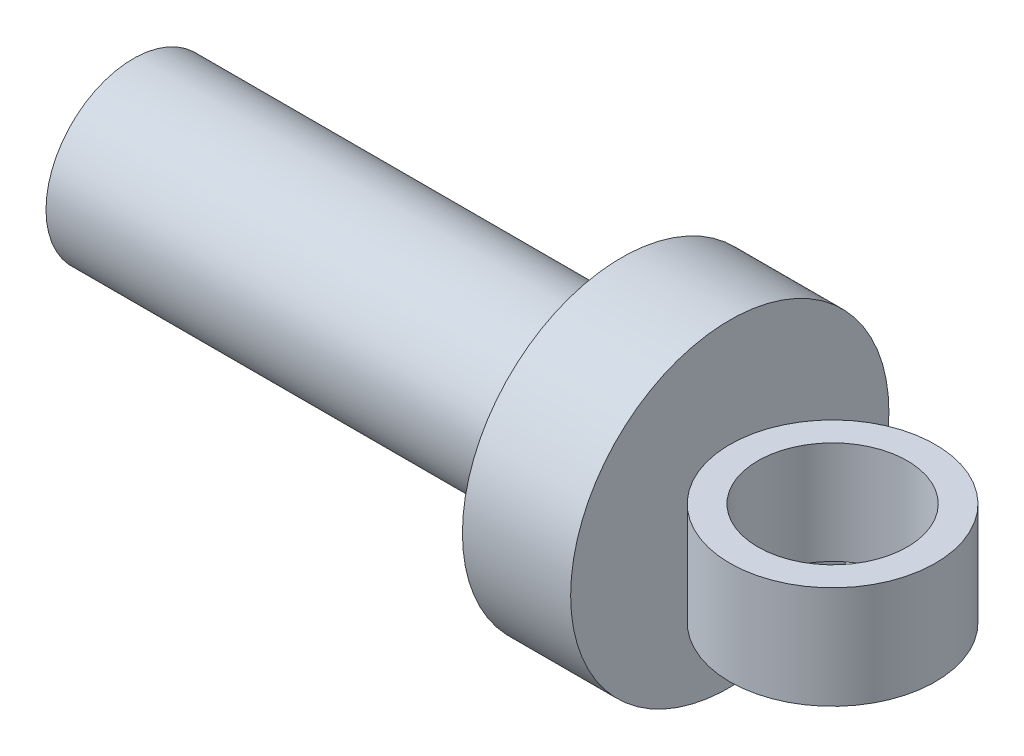
ISO-10303-21;
HEADER;
FILE_DESCRIPTION(('STEP AP214'),'2;1');
FILE_NAME('part.step','',(''),(''),'','','');
FILE_SCHEMA(('AUTOMOTIVE_DESIGN { 1 0 10303 214 1 1 1 1 }'));
ENDSEC;
DATA;
#1=APPLICATION_CONTEXT('core data for automotive mechanical design processes');
#2=APPLICATION_PROTOCOL_DEFINITION('international standard','automotive_design',2000,#1);
#3=PRODUCT_CONTEXT('',#1,'mechanical');
#4=PRODUCT('Part','Part','',(#3));
#5=PRODUCT_RELATED_PRODUCT_CATEGORY('part','',(#4));
#6=PRODUCT_DEFINITION_FORMATION('','',#4);
#7=PRODUCT_DEFINITION_CONTEXT('part definition',#1,'design');
#8=PRODUCT_DEFINITION('design','',#6,#7);
#9=PRODUCT_DEFINITION_SHAPE('','',#8);
#10=(LENGTH_UNIT() NAMED_UNIT(*) SI_UNIT(.MILLI.,.METRE.));
#11=(NAMED_UNIT(*) PLANE_ANGLE_UNIT() SI_UNIT($,.RADIAN.));
#12=(NAMED_UNIT(*) SI_UNIT($,.STERADIAN.) SOLID_ANGLE_UNIT());
#13=UNCERTAINTY_MEASURE_WITH_UNIT(LENGTH_MEASURE(1.E-05),#10,'distance_accuracy_value','');
#14=(GEOMETRIC_REPRESENTATION_CONTEXT(3) GLOBAL_UNCERTAINTY_ASSIGNED_CONTEXT((#13)) GLOBAL_UNIT_ASSIGNED_CONTEXT((#10,
#11,#12)) REPRESENTATION_CONTEXT('',''));
#15=CARTESIAN_POINT('',(0.,0.,0.));
#16=DIRECTION('',(0.,0.,1.));
#17=DIRECTION('',(1.,0.,0.));
#18=AXIS2_PLACEMENT_3D('',#15,#16,#17);
#19=CARTESIAN_POINT('',(20.03,10.,0.));
#20=DIRECTION('',(0.,1.,0.));
#21=DIRECTION('',(0.,0.,1.));
#22=AXIS2_PLACEMENT_3D('',#19,#20,#21);
#23=PLANE('',#22);
#24=CARTESIAN_POINT('',(20.03,10.,0.));
#25=DIRECTION('',(0.,1.,0.));
#26=DIRECTION('',(0.,0.,1.));
#27=AXIS2_PLACEMENT_3D('',#24,#25,#26);
#28=CIRCLE('',#27,20.03);
#29=CARTESIAN_POINT('',(20.03,10.,20.03));
#30=VERTEX_POINT('',#29);
#31=EDGE_CURVE('E11',#30,#30,#28,.T.);
#32=ORIENTED_EDGE('',*,*,#31,.T.);
#33=EDGE_LOOP('',(#32));
#34=FACE_BOUND('',#33,.T.);
#35=CARTESIAN_POINT('',(20.03,10.,0.));
#36=DIRECTION('',(0.,1.,0.));
#37=DIRECTION('',(0.,0.,1.));
#38=AXIS2_PLACEMENT_3D('',#35,#36,#37);
#39=CIRCLE('',#38,14.555);
#40=CARTESIAN_POINT('',(20.03,10.,14.555));
#41=VERTEX_POINT('',#40);
#42=EDGE_CURVE('E53',#41,#41,#39,.T.);
#43=ORIENTED_EDGE('',*,*,#42,.F.);
#44=EDGE_LOOP('',(#43));
#45=FACE_BOUND('',#44,.T.);
#46=ADVANCED_FACE('F42',(#34,#45),#23,.T.);
#47=CARTESIAN_POINT('',(20.03,-10.,0.));
#48=DIRECTION('',(0.,1.,0.));
#49=DIRECTION('',(0.,0.,1.));
#50=AXIS2_PLACEMENT_3D('',#47,#48,#49);
#51=PLANE('',#50);
#52=CARTESIAN_POINT('',(20.03,-10.,0.));
#53=DIRECTION('',(0.,1.,0.));
#54=DIRECTION('',(0.,0.,1.));
#55=AXIS2_PLACEMENT_3D('',#52,#53,#54);
#56=CIRCLE('',#55,20.03);
#57=CARTESIAN_POINT('',(20.03,-10.,20.03));
#58=VERTEX_POINT('',#57);
#59=EDGE_CURVE('E46',#58,#58,#56,.T.);
#60=ORIENTED_EDGE('',*,*,#59,.F.);
#61=EDGE_LOOP('',(#60));
#62=FACE_BOUND('',#61,.T.);
#63=CARTESIAN_POINT('',(20.03,-10.,0.));
#64=DIRECTION('',(0.,1.,0.));
#65=DIRECTION('',(0.,0.,1.));
#66=AXIS2_PLACEMENT_3D('',#63,#64,#65);
#67=CIRCLE('',#66,14.555);
#68=CARTESIAN_POINT('',(20.03,-10.,14.555));
#69=VERTEX_POINT('',#68);
#70=EDGE_CURVE('E55',#69,#69,#67,.T.);
#71=ORIENTED_EDGE('',*,*,#70,.T.);
#72=EDGE_LOOP('',(#71));
#73=FACE_BOUND('',#72,.T.);
#74=ADVANCED_FACE('F65',(#62,#73),#51,.F.);
#75=CARTESIAN_POINT('',(20.03,10.,0.));
#76=DIRECTION('',(0.,-1.,0.));
#77=DIRECTION('',(0.,0.,-1.));
#78=AXIS2_PLACEMENT_3D('',#75,#76,#77);
#79=CYLINDRICAL_SURFACE('',#78,20.03);
#80=ORIENTED_EDGE('',*,*,#31,.F.);
#81=EDGE_LOOP('',(#80));
#82=FACE_BOUND('',#81,.T.);
#83=ORIENTED_EDGE('',*,*,#59,.T.);
#84=EDGE_LOOP('',(#83));
#85=FACE_BOUND('',#84,.T.);
#86=ADVANCED_FACE('F44',(#82,#85),#79,.T.);
#87=CARTESIAN_POINT('',(20.03,10.,0.));
#88=DIRECTION('',(0.,-1.,0.));
#89=DIRECTION('',(0.,0.,-1.));
#90=AXIS2_PLACEMENT_3D('',#87,#88,#89);
#91=CYLINDRICAL_SURFACE('',#90,14.555);
#92=ORIENTED_EDGE('',*,*,#42,.T.);
#93=EDGE_LOOP('',(#92));
#94=FACE_BOUND('',#93,.T.);
#95=ORIENTED_EDGE('',*,*,#70,.F.);
#96=EDGE_LOOP('',(#95));
#97=FACE_BOUND('',#96,.T.);
#98=ADVANCED_FACE('F61',(#94,#97),#91,.F.);
#99=CLOSED_SHELL('',(#46,#74,#86,#98));
#100=MANIFOLD_SOLID_BREP('B2',#99);
#101=CARTESIAN_POINT('',(-116.2,17.,0.));
#102=DIRECTION('',(1.,0.,0.));
#103=DIRECTION('',(0.,0.,-1.));
#104=AXIS2_PLACEMENT_3D('',#101,#102,#103);
#105=PLANE('',#104);
#106=CARTESIAN_POINT('',(-116.2,0.,0.));
#107=DIRECTION('',(-1.,0.,0.));
#108=DIRECTION('',(0.,0.,1.));
#109=AXIS2_PLACEMENT_3D('',#106,#107,#108);
#110=CIRCLE('',#109,12.);
#111=CARTESIAN_POINT('',(-116.2,0.,12.));
#112=VERTEX_POINT('',#111);
#113=EDGE_CURVE('E41',#112,#112,#110,.T.);
#114=ORIENTED_EDGE('',*,*,#113,.F.);
#115=EDGE_LOOP('',(#114));
#116=FACE_BOUND('',#115,.T.);
#117=CARTESIAN_POINT('',(-116.2,0.,0.));
#118=DIRECTION('',(-1.,0.,0.));
#119=DIRECTION('',(0.,0.,1.));
#120=AXIS2_PLACEMENT_3D('',#117,#118,#119);
#121=CIRCLE('',#120,17.);
#122=CARTESIAN_POINT('',(-116.2,0.,17.));
#123=VERTEX_POINT('',#122);
#124=EDGE_CURVE('E131',#123,#123,#121,.T.);
#125=ORIENTED_EDGE('',*,*,#124,.T.);
#126=EDGE_LOOP('',(#125));
#127=FACE_BOUND('',#126,.T.);
#128=ADVANCED_FACE('F103',(#116,#127),#105,.F.);
#129=CARTESIAN_POINT('',(-5.,0.,0.));
#130=DIRECTION('',(-1.,0.,0.));
#131=DIRECTION('',(0.,0.,1.));
#132=AXIS2_PLACEMENT_3D('',#129,#130,#131);
#133=CYLINDRICAL_SURFACE('',#132,12.);
#134=CARTESIAN_POINT('',(-5.,0.,0.));
#135=DIRECTION('',(-1.,0.,0.));
#136=DIRECTION('',(0.,0.,1.));
#137=AXIS2_PLACEMENT_3D('',#134,#135,#136);
#138=CIRCLE('',#137,12.);
#139=CARTESIAN_POINT('',(-5.,0.,12.));
#140=VERTEX_POINT('',#139);
#141=EDGE_CURVE('E109',#140,#140,#138,.T.);
#142=ORIENTED_EDGE('',*,*,#141,.F.);
#143=EDGE_LOOP('',(#142));
#144=FACE_BOUND('',#143,.T.);
#145=ORIENTED_EDGE('',*,*,#113,.T.);
#146=EDGE_LOOP('',(#145));
#147=FACE_BOUND('',#146,.T.);
#148=ADVANCED_FACE('F173',(#144,#147),#133,.F.);
#149=CARTESIAN_POINT('',(-5.,12.,0.));
#150=DIRECTION('',(1.,0.,0.));
#151=DIRECTION('',(0.,0.,-1.));
#152=AXIS2_PLACEMENT_3D('',#149,#150,#151);
#153=PLANE('',#152);
#154=ORIENTED_EDGE('',*,*,#141,.T.);
#155=EDGE_LOOP('',(#154));
#156=FACE_BOUND('',#155,.T.);
#157=ADVANCED_FACE('F168',(#156),#153,.F.);
#158=CARTESIAN_POINT('',(0.,15.,0.));
#159=DIRECTION('',(-1.,0.,0.));
#160=DIRECTION('',(0.,0.,1.));
#161=AXIS2_PLACEMENT_3D('',#158,#159,#160);
#162=PLANE('',#161);
#163=CARTESIAN_POINT('',(0.,0.,0.));
#164=DIRECTION('',(-1.,0.,0.));
#165=DIRECTION('',(0.,0.,1.));
#166=AXIS2_PLACEMENT_3D('',#163,#164,#165);
#167=CIRCLE('',#166,31.);
#168=CARTESIAN_POINT('',(0.,0.,31.));
#169=VERTEX_POINT('',#168);
#170=EDGE_CURVE('E113',#169,#169,#167,.T.);
#171=ORIENTED_EDGE('',*,*,#170,.F.);
#172=EDGE_LOOP('',(#171));
#173=FACE_BOUND('',#172,.T.);
#174=ADVANCED_FACE('F163',(#173),#162,.F.);
#175=CARTESIAN_POINT('',(-5.,0.,0.));
#176=DIRECTION('',(-1.,0.,0.));
#177=DIRECTION('',(0.,0.,1.));
#178=AXIS2_PLACEMENT_3D('',#175,#176,#177);
#179=CYLINDRICAL_SURFACE('',#178,31.);
#180=CARTESIAN_POINT('',(-21.0803843260717,0.,0.));
#181=DIRECTION('',(-1.,0.,0.));
#182=DIRECTION('',(0.,0.,1.));
#183=AXIS2_PLACEMENT_3D('',#180,#181,#182);
#184=CIRCLE('',#183,31.);
#185=CARTESIAN_POINT('',(-21.0803843260717,0.,31.));
#186=VERTEX_POINT('',#185);
#187=EDGE_CURVE('E117',#186,#186,#184,.T.);
#188=ORIENTED_EDGE('',*,*,#187,.F.);
#189=EDGE_LOOP('',(#188));
#190=FACE_BOUND('',#189,.T.);
#191=ORIENTED_EDGE('',*,*,#170,.T.);
#192=EDGE_LOOP('',(#191));
#193=FACE_BOUND('',#192,.T.);
#194=ADVANCED_FACE('F157',(#190,#193),#179,.T.);
#195=CARTESIAN_POINT('',(-21.0803843260717,31.,0.));
#196=DIRECTION('',(1.,0.,0.));
#197=DIRECTION('',(0.,0.,-1.));
#198=AXIS2_PLACEMENT_3D('',#195,#196,#197);
#199=PLANE('',#198);
#200=CARTESIAN_POINT('',(-21.0803843260717,0.,0.));
#201=DIRECTION('',(-1.,0.,0.));
#202=DIRECTION('',(0.,0.,1.));
#203=AXIS2_PLACEMENT_3D('',#200,#201,#202);
#204=CIRCLE('',#203,30.);
#205=CARTESIAN_POINT('',(-21.0803843260717,0.,30.));
#206=VERTEX_POINT('',#205);
#207=EDGE_CURVE('E122',#206,#206,#204,.T.);
#208=ORIENTED_EDGE('',*,*,#207,.F.);
#209=EDGE_LOOP('',(#208));
#210=FACE_BOUND('',#209,.T.);
#211=ORIENTED_EDGE('',*,*,#187,.T.);
#212=EDGE_LOOP('',(#211));
#213=FACE_BOUND('',#212,.T.);
#214=ADVANCED_FACE('F151',(#210,#213),#199,.F.);
#215=CARTESIAN_POINT('',(-5.,0.,0.));
#216=DIRECTION('',(-1.,0.,0.));
#217=DIRECTION('',(0.,0.,1.));
#218=AXIS2_PLACEMENT_3D('',#215,#216,#217);
#219=CYLINDRICAL_SURFACE('',#218,30.);
#220=CARTESIAN_POINT('',(-1.,0.,0.));
#221=DIRECTION('',(-1.,0.,0.));
#222=DIRECTION('',(0.,0.,1.));
#223=AXIS2_PLACEMENT_3D('',#220,#221,#222);
#224=CIRCLE('',#223,30.);
#225=CARTESIAN_POINT('',(-1.,0.,30.));
#226=VERTEX_POINT('',#225);
#227=EDGE_CURVE('E125',#226,#226,#224,.T.);
#228=ORIENTED_EDGE('',*,*,#227,.F.);
#229=EDGE_LOOP('',(#228));
#230=FACE_BOUND('',#229,.T.);
#231=ORIENTED_EDGE('',*,*,#207,.T.);
#232=EDGE_LOOP('',(#231));
#233=FACE_BOUND('',#232,.T.);
#234=ADVANCED_FACE('F145',(#230,#233),#219,.F.);
#235=CARTESIAN_POINT('',(-1.,30.,0.));
#236=DIRECTION('',(1.,0.,0.));
#237=DIRECTION('',(0.,0.,-1.));
#238=AXIS2_PLACEMENT_3D('',#235,#236,#237);
#239=PLANE('',#238);
#240=CARTESIAN_POINT('',(-1.,0.,0.));
#241=DIRECTION('',(-1.,0.,0.));
#242=DIRECTION('',(0.,0.,1.));
#243=AXIS2_PLACEMENT_3D('',#240,#241,#242);
#244=CIRCLE('',#243,17.);
#245=CARTESIAN_POINT('',(-1.,0.,17.));
#246=VERTEX_POINT('',#245);
#247=EDGE_CURVE('E128',#246,#246,#244,.T.);
#248=ORIENTED_EDGE('',*,*,#247,.F.);
#249=EDGE_LOOP('',(#248));
#250=FACE_BOUND('',#249,.T.);
#251=ORIENTED_EDGE('',*,*,#227,.T.);
#252=EDGE_LOOP('',(#251));
#253=FACE_BOUND('',#252,.T.);
#254=ADVANCED_FACE('F139',(#250,#253),#239,.F.);
#255=CARTESIAN_POINT('',(-5.,0.,0.));
#256=DIRECTION('',(-1.,0.,0.));
#257=DIRECTION('',(0.,0.,1.));
#258=AXIS2_PLACEMENT_3D('',#255,#256,#257);
#259=CYLINDRICAL_SURFACE('',#258,17.);
#260=ORIENTED_EDGE('',*,*,#124,.F.);
#261=EDGE_LOOP('',(#260));
#262=FACE_BOUND('',#261,.T.);
#263=ORIENTED_EDGE('',*,*,#247,.T.);
#264=EDGE_LOOP('',(#263));
#265=FACE_BOUND('',#264,.T.);
#266=ADVANCED_FACE('F136',(#262,#265),#259,.T.);
#267=CLOSED_SHELL('',(#128,#148,#157,#174,#194,#214,#234,#254,#266));
#268=MANIFOLD_SOLID_BREP('B6',#267);
#269=ADVANCED_BREP_SHAPE_REPRESENTATION('',(#18,#100,#268),#14);
#270=SHAPE_DEFINITION_REPRESENTATION(#9,#269);
ENDSEC;
END-ISO-10303-21;
